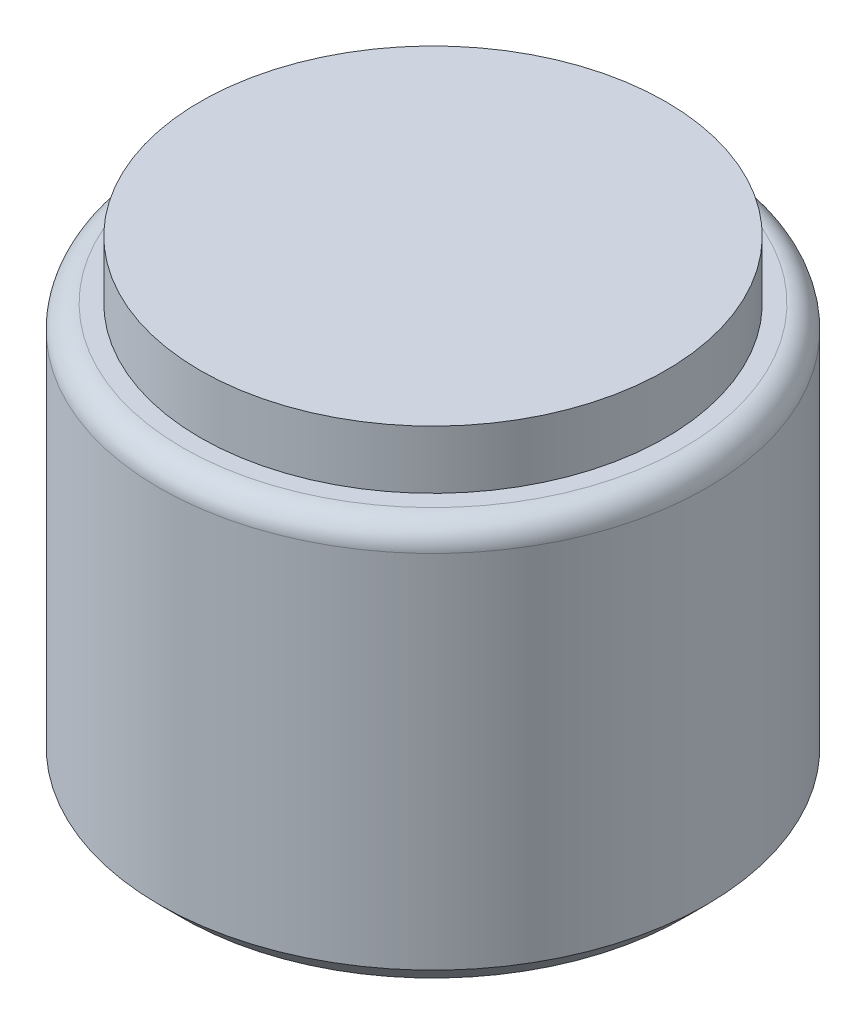
ISO-10303-21;
HEADER;
FILE_DESCRIPTION(('STEP AP214'),'2;1');
FILE_NAME('part.step','',(''),(''),'','','');
FILE_SCHEMA(('AUTOMOTIVE_DESIGN { 1 0 10303 214 1 1 1 1 }'));
ENDSEC;
DATA;
#1=APPLICATION_CONTEXT('core data for automotive mechanical design processes');
#2=APPLICATION_PROTOCOL_DEFINITION('international standard','automotive_design',2000,#1);
#3=PRODUCT_CONTEXT('',#1,'mechanical');
#4=PRODUCT('Part','Part','',(#3));
#5=PRODUCT_RELATED_PRODUCT_CATEGORY('part','',(#4));
#6=PRODUCT_DEFINITION_FORMATION('','',#4);
#7=PRODUCT_DEFINITION_CONTEXT('part definition',#1,'design');
#8=PRODUCT_DEFINITION('design','',#6,#7);
#9=PRODUCT_DEFINITION_SHAPE('','',#8);
#10=(LENGTH_UNIT() NAMED_UNIT(*) SI_UNIT(.MILLI.,.METRE.));
#11=(NAMED_UNIT(*) PLANE_ANGLE_UNIT() SI_UNIT($,.RADIAN.));
#12=(NAMED_UNIT(*) SI_UNIT($,.STERADIAN.) SOLID_ANGLE_UNIT());
#13=UNCERTAINTY_MEASURE_WITH_UNIT(LENGTH_MEASURE(1.E-05),#10,'distance_accuracy_value','');
#14=(GEOMETRIC_REPRESENTATION_CONTEXT(3) GLOBAL_UNCERTAINTY_ASSIGNED_CONTEXT((#13)) GLOBAL_UNIT_ASSIGNED_CONTEXT((#10,
#11,#12)) REPRESENTATION_CONTEXT('',''));
#15=CARTESIAN_POINT('',(0.,0.,0.));
#16=DIRECTION('',(0.,0.,1.));
#17=DIRECTION('',(1.,0.,0.));
#18=AXIS2_PLACEMENT_3D('',#15,#16,#17);
#19=CARTESIAN_POINT('',(0.,0.,0.));
#20=DIRECTION('',(0.,1.,0.));
#21=DIRECTION('',(0.,0.,1.));
#22=AXIS2_PLACEMENT_3D('',#19,#20,#21);
#23=PLANE('',#22);
#24=CARTESIAN_POINT('',(0.,0.,0.));
#25=DIRECTION('',(0.,-1.,0.));
#26=DIRECTION('',(0.,0.,-1.));
#27=AXIS2_PLACEMENT_3D('',#24,#25,#26);
#28=CIRCLE('',#27,100.);
#29=CARTESIAN_POINT('',(0.,0.,-100.));
#30=VERTEX_POINT('',#29);
#31=EDGE_CURVE('E71',#30,#30,#28,.T.);
#32=ORIENTED_EDGE('',*,*,#31,.F.);
#33=EDGE_LOOP('',(#32));
#34=FACE_BOUND('',#33,.T.);
#35=ADVANCED_FACE('F37',(#34),#23,.T.);
#36=CARTESIAN_POINT('',(0.,0.,0.));
#37=DIRECTION('',(0.,-1.,0.));
#38=DIRECTION('',(0.,0.,-1.));
#39=AXIS2_PLACEMENT_3D('',#36,#37,#38);
#40=CYLINDRICAL_SURFACE('',#39,100.);
#41=ORIENTED_EDGE('',*,*,#31,.T.);
#42=EDGE_LOOP('',(#41));
#43=FACE_BOUND('',#42,.T.);
#44=CARTESIAN_POINT('',(0.,-25.,0.));
#45=DIRECTION('',(0.,-1.,0.));
#46=DIRECTION('',(0.,0.,-1.));
#47=AXIS2_PLACEMENT_3D('',#44,#45,#46);
#48=CIRCLE('',#47,100.);
#49=CARTESIAN_POINT('',(0.,-25.,-100.));
#50=VERTEX_POINT('',#49);
#51=EDGE_CURVE('E68',#50,#50,#48,.T.);
#52=ORIENTED_EDGE('',*,*,#51,.F.);
#53=EDGE_LOOP('',(#52));
#54=FACE_BOUND('',#53,.T.);
#55=ADVANCED_FACE('F94',(#43,#54),#40,.T.);
#56=CARTESIAN_POINT('',(100.,-25.,0.));
#57=DIRECTION('',(0.,1.,0.));
#58=DIRECTION('',(0.,0.,1.));
#59=AXIS2_PLACEMENT_3D('',#56,#57,#58);
#60=PLANE('',#59);
#61=CARTESIAN_POINT('',(0.,-25.,0.));
#62=DIRECTION('',(0.,1.,0.));
#63=DIRECTION('',(0.,0.,1.));
#64=AXIS2_PLACEMENT_3D('',#61,#62,#63);
#65=CIRCLE('',#64,107.5);
#66=CARTESIAN_POINT('',(0.,-25.,107.5));
#67=VERTEX_POINT('',#66);
#68=EDGE_CURVE('E11',#67,#67,#65,.T.);
#69=ORIENTED_EDGE('',*,*,#68,.T.);
#70=EDGE_LOOP('',(#69));
#71=FACE_BOUND('',#70,.T.);
#72=ORIENTED_EDGE('',*,*,#51,.T.);
#73=EDGE_LOOP('',(#72));
#74=FACE_BOUND('',#73,.T.);
#75=ADVANCED_FACE('F100',(#71,#74),#60,.T.);
#76=CARTESIAN_POINT('',(0.,0.,0.));
#77=DIRECTION('',(0.,-1.,0.));
#78=DIRECTION('',(0.,0.,-1.));
#79=AXIS2_PLACEMENT_3D('',#76,#77,#78);
#80=CYLINDRICAL_SURFACE('',#79,117.5);
#81=CARTESIAN_POINT('',(0.,-35.,0.));
#82=DIRECTION('',(0.,1.,0.));
#83=DIRECTION('',(0.,0.,1.));
#84=AXIS2_PLACEMENT_3D('',#81,#82,#83);
#85=CIRCLE('',#84,117.5);
#86=CARTESIAN_POINT('',(0.,-35.,117.5));
#87=VERTEX_POINT('',#86);
#88=EDGE_CURVE('E44',#87,#87,#85,.F.);
#89=ORIENTED_EDGE('',*,*,#88,.T.);
#90=EDGE_LOOP('',(#89));
#91=FACE_BOUND('',#90,.T.);
#92=CARTESIAN_POINT('',(0.,-190.,0.));
#93=DIRECTION('',(0.,-1.,0.));
#94=DIRECTION('',(0.,0.,-1.));
#95=AXIS2_PLACEMENT_3D('',#92,#93,#94);
#96=CIRCLE('',#95,117.5);
#97=CARTESIAN_POINT('',(0.,-190.,-117.5));
#98=VERTEX_POINT('',#97);
#99=EDGE_CURVE('E77',#98,#98,#96,.F.);
#100=ORIENTED_EDGE('',*,*,#99,.T.);
#101=EDGE_LOOP('',(#100));
#102=FACE_BOUND('',#101,.T.);
#103=ADVANCED_FACE('F82',(#91,#102),#80,.T.);
#104=CARTESIAN_POINT('',(117.5,-200.,0.));
#105=DIRECTION('',(0.,-1.,0.));
#106=DIRECTION('',(0.,0.,-1.));
#107=AXIS2_PLACEMENT_3D('',#104,#105,#106);
#108=PLANE('',#107);
#109=CARTESIAN_POINT('',(0.,-200.,0.));
#110=DIRECTION('',(0.,-1.,0.));
#111=DIRECTION('',(0.,0.,-1.));
#112=AXIS2_PLACEMENT_3D('',#109,#110,#111);
#113=CIRCLE('',#112,107.5);
#114=CARTESIAN_POINT('',(0.,-200.,-107.5));
#115=VERTEX_POINT('',#114);
#116=EDGE_CURVE('E74',#115,#115,#113,.T.);
#117=ORIENTED_EDGE('',*,*,#116,.T.);
#118=EDGE_LOOP('',(#117));
#119=FACE_BOUND('',#118,.T.);
#120=CARTESIAN_POINT('',(0.,-200.,0.));
#121=DIRECTION('',(0.,-1.,0.));
#122=DIRECTION('',(0.,0.,-1.));
#123=AXIS2_PLACEMENT_3D('',#120,#121,#122);
#124=CIRCLE('',#123,67.5);
#125=CARTESIAN_POINT('',(0.,-200.,-67.5));
#126=VERTEX_POINT('',#125);
#127=EDGE_CURVE('E61',#126,#126,#124,.T.);
#128=ORIENTED_EDGE('',*,*,#127,.F.);
#129=EDGE_LOOP('',(#128));
#130=FACE_BOUND('',#129,.T.);
#131=ADVANCED_FACE('F110',(#119,#130),#108,.T.);
#132=CARTESIAN_POINT('',(0.,0.,0.));
#133=DIRECTION('',(0.,-1.,0.));
#134=DIRECTION('',(0.,0.,-1.));
#135=AXIS2_PLACEMENT_3D('',#132,#133,#134);
#136=CYLINDRICAL_SURFACE('',#135,67.5);
#137=ORIENTED_EDGE('',*,*,#127,.T.);
#138=EDGE_LOOP('',(#137));
#139=FACE_BOUND('',#138,.T.);
#140=CARTESIAN_POINT('',(0.,-165.,0.));
#141=DIRECTION('',(0.,-1.,0.));
#142=DIRECTION('',(0.,0.,-1.));
#143=AXIS2_PLACEMENT_3D('',#140,#141,#142);
#144=CIRCLE('',#143,67.5);
#145=CARTESIAN_POINT('',(0.,-165.,-67.5));
#146=VERTEX_POINT('',#145);
#147=EDGE_CURVE('E57',#146,#146,#144,.T.);
#148=ORIENTED_EDGE('',*,*,#147,.F.);
#149=EDGE_LOOP('',(#148));
#150=FACE_BOUND('',#149,.T.);
#151=ADVANCED_FACE('F113',(#139,#150),#136,.F.);
#152=CARTESIAN_POINT('',(67.5,-165.,0.));
#153=DIRECTION('',(0.,-1.,0.));
#154=DIRECTION('',(0.,0.,-1.));
#155=AXIS2_PLACEMENT_3D('',#152,#153,#154);
#156=PLANE('',#155);
#157=CARTESIAN_POINT('',(0.,-165.,0.));
#158=DIRECTION('',(0.,-1.,0.));
#159=DIRECTION('',(0.,0.,-1.));
#160=AXIS2_PLACEMENT_3D('',#157,#158,#159);
#161=CIRCLE('',#160,6.99999999999999);
#162=CARTESIAN_POINT('',(0.,-165.,-6.99999999999999));
#163=VERTEX_POINT('',#162);
#164=EDGE_CURVE('E58',#163,#163,#161,.T.);
#165=ORIENTED_EDGE('',*,*,#164,.F.);
#166=EDGE_LOOP('',(#165));
#167=FACE_BOUND('',#166,.T.);
#168=ORIENTED_EDGE('',*,*,#147,.T.);
#169=EDGE_LOOP('',(#168));
#170=FACE_BOUND('',#169,.T.);
#171=ADVANCED_FACE('F51',(#167,#170),#156,.T.);
#172=CARTESIAN_POINT('',(0.,-127.,0.));
#173=DIRECTION('',(0.,-1.,0.));
#174=DIRECTION('',(0.,0.,-1.));
#175=AXIS2_PLACEMENT_3D('',#172,#173,#174);
#176=CONICAL_SURFACE('',#175,6.99999999999998,1.02974425867666);
#177=CARTESIAN_POINT('',(0.,-122.793975666807,0.));
#178=VERTEX_POINT('',#177);
#179=VERTEX_LOOP('',#178);
#180=FACE_BOUND('',#179,.T.);
#181=CARTESIAN_POINT('',(0.,-127.,0.));
#182=DIRECTION('',(0.,-1.,0.));
#183=DIRECTION('',(0.,0.,-1.));
#184=AXIS2_PLACEMENT_3D('',#181,#182,#183);
#185=CIRCLE('',#184,6.99999999999998);
#186=CARTESIAN_POINT('',(0.,-127.,-6.99999999999998));
#187=VERTEX_POINT('',#186);
#188=EDGE_CURVE('E55',#187,#187,#185,.T.);
#189=ORIENTED_EDGE('',*,*,#188,.T.);
#190=EDGE_LOOP('',(#189));
#191=FACE_BOUND('',#190,.T.);
#192=ADVANCED_FACE('F47',(#180,#191),#176,.F.);
#193=CARTESIAN_POINT('',(0.,-165.,0.));
#194=DIRECTION('',(0.,-1.,0.));
#195=DIRECTION('',(0.,0.,-1.));
#196=AXIS2_PLACEMENT_3D('',#193,#194,#195);
#197=CYLINDRICAL_SURFACE('',#196,6.99999999999999);
#198=ORIENTED_EDGE('',*,*,#188,.F.);
#199=EDGE_LOOP('',(#198));
#200=FACE_BOUND('',#199,.T.);
#201=ORIENTED_EDGE('',*,*,#164,.T.);
#202=EDGE_LOOP('',(#201));
#203=FACE_BOUND('',#202,.T.);
#204=ADVANCED_FACE('F50',(#200,#203),#197,.F.);
#205=CARTESIAN_POINT('',(0.,-200.,0.));
#206=DIRECTION('',(0.,1.,0.));
#207=DIRECTION('',(0.,0.,1.));
#208=AXIS2_PLACEMENT_3D('',#205,#206,#207);
#209=CONICAL_SURFACE('',#208,107.5,0.785398163397443);
#210=ORIENTED_EDGE('',*,*,#99,.F.);
#211=EDGE_LOOP('',(#210));
#212=FACE_BOUND('',#211,.T.);
#213=ORIENTED_EDGE('',*,*,#116,.F.);
#214=EDGE_LOOP('',(#213));
#215=FACE_BOUND('',#214,.T.);
#216=ADVANCED_FACE('F86',(#212,#215),#209,.T.);
#217=CARTESIAN_POINT('',(0.,-35.,0.));
#218=DIRECTION('',(0.,1.,0.));
#219=DIRECTION('',(0.,0.,1.));
#220=AXIS2_PLACEMENT_3D('',#217,#218,#219);
#221=TOROIDAL_SURFACE('',#220,107.5,10.);
#222=ORIENTED_EDGE('',*,*,#68,.F.);
#223=EDGE_LOOP('',(#222));
#224=FACE_BOUND('',#223,.T.);
#225=ORIENTED_EDGE('',*,*,#88,.F.);
#226=EDGE_LOOP('',(#225));
#227=FACE_BOUND('',#226,.T.);
#228=ADVANCED_FACE('F39',(#224,#227),#221,.T.);
#229=CLOSED_SHELL('',(#35,#55,#75,#103,#131,#151,#171,#192,#204,#216,#228));
#230=MANIFOLD_SOLID_BREP('B2',#229);
#231=ADVANCED_BREP_SHAPE_REPRESENTATION('',(#18,#230),#14);
#232=SHAPE_DEFINITION_REPRESENTATION(#9,#231);
ENDSEC;
END-ISO-10303-21;
